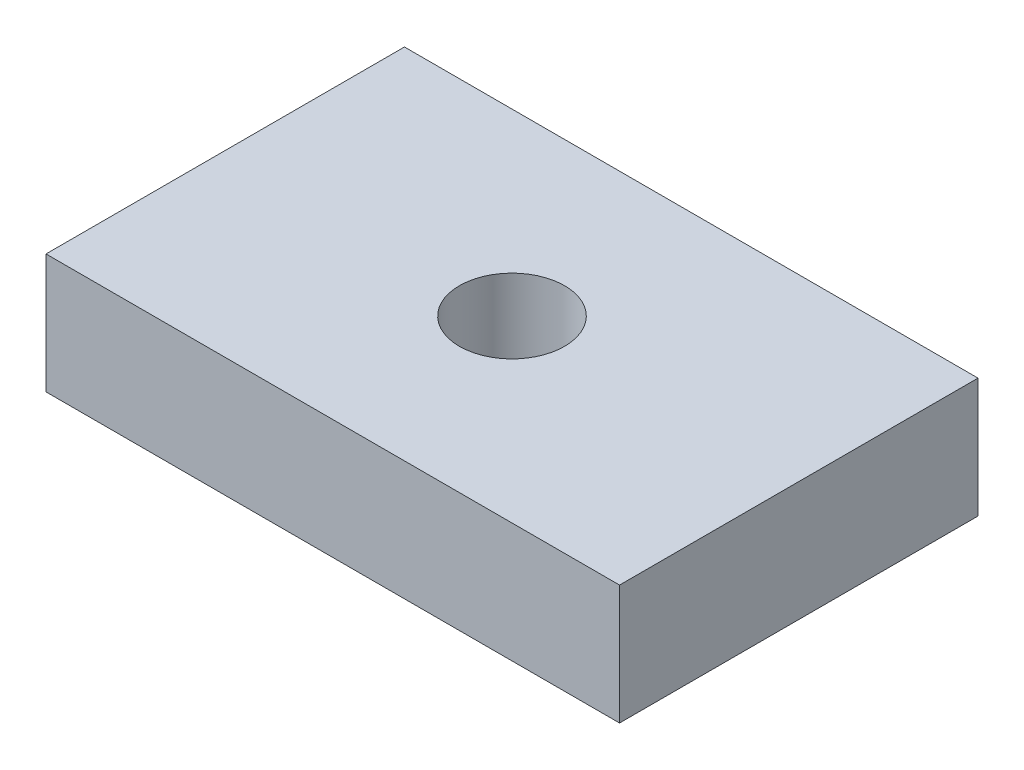
ISO-10303-21;
HEADER;
FILE_DESCRIPTION(('STEP AP214'),'2;1');
FILE_NAME('part.step','',(''),(''),'','','');
FILE_SCHEMA(('AUTOMOTIVE_DESIGN { 1 0 10303 214 1 1 1 1 }'));
ENDSEC;
DATA;
#1=APPLICATION_CONTEXT('core data for automotive mechanical design processes');
#2=APPLICATION_PROTOCOL_DEFINITION('international standard','automotive_design',2000,#1);
#3=PRODUCT_CONTEXT('',#1,'mechanical');
#4=PRODUCT('Part','Part','',(#3));
#5=PRODUCT_RELATED_PRODUCT_CATEGORY('part','',(#4));
#6=PRODUCT_DEFINITION_FORMATION('','',#4);
#7=PRODUCT_DEFINITION_CONTEXT('part definition',#1,'design');
#8=PRODUCT_DEFINITION('design','',#6,#7);
#9=PRODUCT_DEFINITION_SHAPE('','',#8);
#10=(LENGTH_UNIT() NAMED_UNIT(*) SI_UNIT(.MILLI.,.METRE.));
#11=(NAMED_UNIT(*) PLANE_ANGLE_UNIT() SI_UNIT($,.RADIAN.));
#12=(NAMED_UNIT(*) SI_UNIT($,.STERADIAN.) SOLID_ANGLE_UNIT());
#13=UNCERTAINTY_MEASURE_WITH_UNIT(LENGTH_MEASURE(1.E-05),#10,'distance_accuracy_value','');
#14=(GEOMETRIC_REPRESENTATION_CONTEXT(3) GLOBAL_UNCERTAINTY_ASSIGNED_CONTEXT((#13)) GLOBAL_UNIT_ASSIGNED_CONTEXT((#10,
#11,#12)) REPRESENTATION_CONTEXT('',''));
#15=CARTESIAN_POINT('',(0.,0.,0.));
#16=DIRECTION('',(0.,0.,1.));
#17=DIRECTION('',(1.,0.,0.));
#18=AXIS2_PLACEMENT_3D('',#15,#16,#17);
#19=CARTESIAN_POINT('',(0.,5.,0.));
#20=DIRECTION('',(0.,1.,0.));
#21=DIRECTION('',(0.,0.,1.));
#22=AXIS2_PLACEMENT_3D('',#19,#20,#21);
#23=PLANE('',#22);
#24=DIRECTION('',(0.,0.,1.));
#25=VECTOR('',#24,1.);
#26=CARTESIAN_POINT('',(-12.,5.,7.5));
#27=LINE('',#26,#25);
#28=CARTESIAN_POINT('',(-12.,5.,-7.5));
#29=VERTEX_POINT('',#28);
#30=CARTESIAN_POINT('',(-12.,5.,7.5));
#31=VERTEX_POINT('',#30);
#32=EDGE_CURVE('E85',#29,#31,#27,.T.);
#33=ORIENTED_EDGE('',*,*,#32,.T.);
#34=DIRECTION('',(1.,0.,0.));
#35=VECTOR('',#34,1.);
#36=CARTESIAN_POINT('',(12.,5.,7.5));
#37=LINE('',#36,#35);
#38=CARTESIAN_POINT('',(12.,5.,7.5));
#39=VERTEX_POINT('',#38);
#40=EDGE_CURVE('E80',#31,#39,#37,.T.);
#41=ORIENTED_EDGE('',*,*,#40,.T.);
#42=DIRECTION('',(0.,0.,-1.));
#43=VECTOR('',#42,1.);
#44=CARTESIAN_POINT('',(12.,5.,7.5));
#45=LINE('',#44,#43);
#46=CARTESIAN_POINT('',(12.,5.,-7.5));
#47=VERTEX_POINT('',#46);
#48=EDGE_CURVE('E83',#39,#47,#45,.T.);
#49=ORIENTED_EDGE('',*,*,#48,.T.);
#50=DIRECTION('',(-1.,0.,0.));
#51=VECTOR('',#50,1.);
#52=CARTESIAN_POINT('',(12.,5.,-7.5));
#53=LINE('',#52,#51);
#54=EDGE_CURVE('E50',#47,#29,#53,.T.);
#55=ORIENTED_EDGE('',*,*,#54,.T.);
#56=EDGE_LOOP('',(#33,#41,#49,#55));
#57=FACE_BOUND('',#56,.T.);
#58=CARTESIAN_POINT('',(0.,5.,0.));
#59=DIRECTION('',(0.,1.,0.));
#60=DIRECTION('',(0.,0.,1.));
#61=AXIS2_PLACEMENT_3D('',#58,#59,#60);
#62=CIRCLE('',#61,2.2);
#63=CARTESIAN_POINT('',(0.,5.,2.2));
#64=VERTEX_POINT('',#63);
#65=EDGE_CURVE('E100',#64,#64,#62,.T.);
#66=ORIENTED_EDGE('',*,*,#65,.F.);
#67=EDGE_LOOP('',(#66));
#68=FACE_BOUND('',#67,.T.);
#69=ADVANCED_FACE('F33',(#57,#68),#23,.T.);
#70=CARTESIAN_POINT('',(0.,0.,0.));
#71=DIRECTION('',(0.,1.,0.));
#72=DIRECTION('',(0.,0.,1.));
#73=AXIS2_PLACEMENT_3D('',#70,#71,#72);
#74=PLANE('',#73);
#75=DIRECTION('',(0.,0.,1.));
#76=VECTOR('',#75,1.);
#77=CARTESIAN_POINT('',(-12.,0.,7.5));
#78=LINE('',#77,#76);
#79=CARTESIAN_POINT('',(-12.,0.,-7.5));
#80=VERTEX_POINT('',#79);
#81=CARTESIAN_POINT('',(-12.,0.,7.5));
#82=VERTEX_POINT('',#81);
#83=EDGE_CURVE('E97',#80,#82,#78,.T.);
#84=ORIENTED_EDGE('',*,*,#83,.F.);
#85=DIRECTION('',(-1.,0.,0.));
#86=VECTOR('',#85,1.);
#87=CARTESIAN_POINT('',(12.,0.,-7.5));
#88=LINE('',#87,#86);
#89=CARTESIAN_POINT('',(12.,0.,-7.5));
#90=VERTEX_POINT('',#89);
#91=EDGE_CURVE('E73',#90,#80,#88,.T.);
#92=ORIENTED_EDGE('',*,*,#91,.F.);
#93=DIRECTION('',(0.,0.,-1.));
#94=VECTOR('',#93,1.);
#95=CARTESIAN_POINT('',(12.,0.,7.5));
#96=LINE('',#95,#94);
#97=CARTESIAN_POINT('',(12.,0.,7.5));
#98=VERTEX_POINT('',#97);
#99=EDGE_CURVE('E67',#98,#90,#96,.T.);
#100=ORIENTED_EDGE('',*,*,#99,.F.);
#101=DIRECTION('',(1.,0.,0.));
#102=VECTOR('',#101,1.);
#103=CARTESIAN_POINT('',(12.,0.,7.5));
#104=LINE('',#103,#102);
#105=EDGE_CURVE('E89',#82,#98,#104,.T.);
#106=ORIENTED_EDGE('',*,*,#105,.F.);
#107=EDGE_LOOP('',(#84,#92,#100,#106));
#108=FACE_BOUND('',#107,.T.);
#109=CARTESIAN_POINT('',(0.,0.,0.));
#110=DIRECTION('',(0.,1.,0.));
#111=DIRECTION('',(0.,0.,1.));
#112=AXIS2_PLACEMENT_3D('',#109,#110,#111);
#113=CIRCLE('',#112,2.2);
#114=CARTESIAN_POINT('',(0.,0.,2.2));
#115=VERTEX_POINT('',#114);
#116=EDGE_CURVE('E112',#115,#115,#113,.T.);
#117=ORIENTED_EDGE('',*,*,#116,.T.);
#118=EDGE_LOOP('',(#117));
#119=FACE_BOUND('',#118,.T.);
#120=ADVANCED_FACE('F108',(#108,#119),#74,.F.);
#121=CARTESIAN_POINT('',(-12.,5.,7.5));
#122=DIRECTION('',(1.,0.,0.));
#123=DIRECTION('',(0.,0.,-1.));
#124=AXIS2_PLACEMENT_3D('',#121,#122,#123);
#125=PLANE('',#124);
#126=ORIENTED_EDGE('',*,*,#83,.T.);
#127=DIRECTION('',(0.,-1.,0.));
#128=VECTOR('',#127,1.);
#129=CARTESIAN_POINT('',(-12.,5.,7.5));
#130=LINE('',#129,#128);
#131=EDGE_CURVE('E11',#31,#82,#130,.T.);
#132=ORIENTED_EDGE('',*,*,#131,.F.);
#133=ORIENTED_EDGE('',*,*,#32,.F.);
#134=DIRECTION('',(0.,-1.,0.));
#135=VECTOR('',#134,1.);
#136=CARTESIAN_POINT('',(-12.,5.,-7.5));
#137=LINE('',#136,#135);
#138=EDGE_CURVE('E93',#29,#80,#137,.T.);
#139=ORIENTED_EDGE('',*,*,#138,.T.);
#140=EDGE_LOOP('',(#126,#132,#133,#139));
#141=FACE_BOUND('',#140,.T.);
#142=ADVANCED_FACE('F35',(#141),#125,.F.);
#143=CARTESIAN_POINT('',(12.,5.,7.5));
#144=DIRECTION('',(0.,0.,-1.));
#145=DIRECTION('',(-1.,0.,0.));
#146=AXIS2_PLACEMENT_3D('',#143,#144,#145);
#147=PLANE('',#146);
#148=ORIENTED_EDGE('',*,*,#105,.T.);
#149=DIRECTION('',(0.,-1.,0.));
#150=VECTOR('',#149,1.);
#151=CARTESIAN_POINT('',(12.,5.,7.5));
#152=LINE('',#151,#150);
#153=EDGE_CURVE('E42',#39,#98,#152,.T.);
#154=ORIENTED_EDGE('',*,*,#153,.F.);
#155=ORIENTED_EDGE('',*,*,#40,.F.);
#156=ORIENTED_EDGE('',*,*,#131,.T.);
#157=EDGE_LOOP('',(#148,#154,#155,#156));
#158=FACE_BOUND('',#157,.T.);
#159=ADVANCED_FACE('F88',(#158),#147,.F.);
#160=CARTESIAN_POINT('',(12.,5.,7.5));
#161=DIRECTION('',(-1.,0.,0.));
#162=DIRECTION('',(0.,0.,1.));
#163=AXIS2_PLACEMENT_3D('',#160,#161,#162);
#164=PLANE('',#163);
#165=ORIENTED_EDGE('',*,*,#99,.T.);
#166=DIRECTION('',(0.,-1.,0.));
#167=VECTOR('',#166,1.);
#168=CARTESIAN_POINT('',(12.,5.,-7.5));
#169=LINE('',#168,#167);
#170=EDGE_CURVE('E90',#47,#90,#169,.T.);
#171=ORIENTED_EDGE('',*,*,#170,.F.);
#172=ORIENTED_EDGE('',*,*,#48,.F.);
#173=ORIENTED_EDGE('',*,*,#153,.T.);
#174=EDGE_LOOP('',(#165,#171,#172,#173));
#175=FACE_BOUND('',#174,.T.);
#176=ADVANCED_FACE('F91',(#175),#164,.F.);
#177=CARTESIAN_POINT('',(12.,5.,-7.5));
#178=DIRECTION('',(0.,0.,1.));
#179=DIRECTION('',(1.,0.,0.));
#180=AXIS2_PLACEMENT_3D('',#177,#178,#179);
#181=PLANE('',#180);
#182=ORIENTED_EDGE('',*,*,#91,.T.);
#183=ORIENTED_EDGE('',*,*,#138,.F.);
#184=ORIENTED_EDGE('',*,*,#54,.F.);
#185=ORIENTED_EDGE('',*,*,#170,.T.);
#186=EDGE_LOOP('',(#182,#183,#184,#185));
#187=FACE_BOUND('',#186,.T.);
#188=ADVANCED_FACE('F105',(#187),#181,.F.);
#189=CARTESIAN_POINT('',(0.,5.,0.));
#190=DIRECTION('',(0.,-1.,0.));
#191=DIRECTION('',(0.,0.,-1.));
#192=AXIS2_PLACEMENT_3D('',#189,#190,#191);
#193=CYLINDRICAL_SURFACE('',#192,2.2);
#194=ORIENTED_EDGE('',*,*,#65,.T.);
#195=EDGE_LOOP('',(#194));
#196=FACE_BOUND('',#195,.T.);
#197=ORIENTED_EDGE('',*,*,#116,.F.);
#198=EDGE_LOOP('',(#197));
#199=FACE_BOUND('',#198,.T.);
#200=ADVANCED_FACE('F118',(#196,#199),#193,.F.);
#201=CLOSED_SHELL('',(#69,#120,#142,#159,#176,#188,#200));
#202=MANIFOLD_SOLID_BREP('B2',#201);
#203=ADVANCED_BREP_SHAPE_REPRESENTATION('',(#18,#202),#14);
#204=SHAPE_DEFINITION_REPRESENTATION(#9,#203);
ENDSEC;
END-ISO-10303-21;
